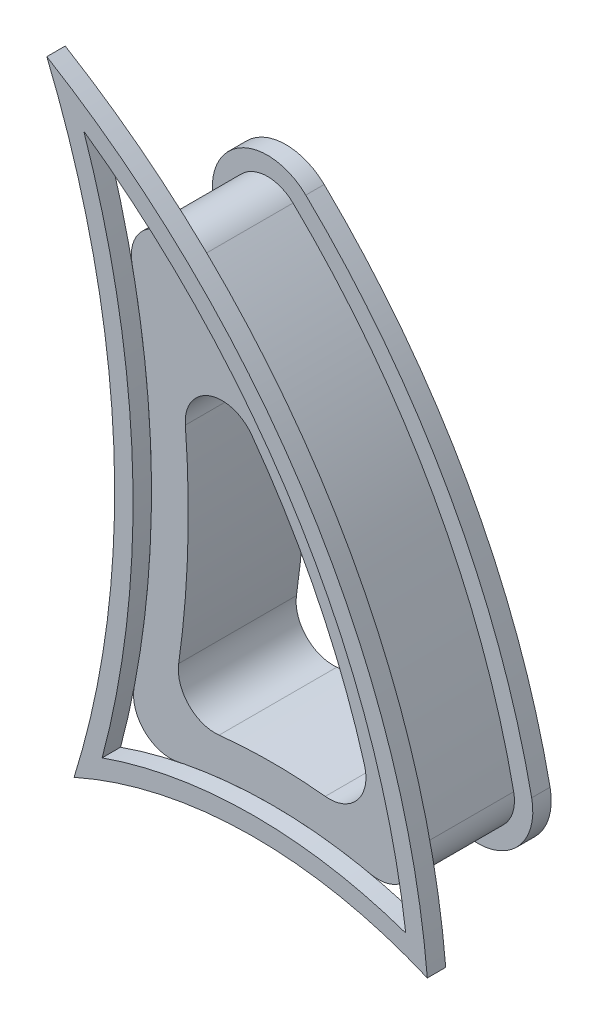
ISO-10303-21;
HEADER;
FILE_DESCRIPTION(('STEP AP214'),'2;1');
FILE_NAME('part.step','',(''),(''),'','','');
FILE_SCHEMA(('AUTOMOTIVE_DESIGN { 1 0 10303 214 1 1 1 1 }'));
ENDSEC;
DATA;
#1=APPLICATION_CONTEXT('core data for automotive mechanical design processes');
#2=APPLICATION_PROTOCOL_DEFINITION('international standard','automotive_design',2000,#1);
#3=PRODUCT_CONTEXT('',#1,'mechanical');
#4=PRODUCT('Part','Part','',(#3));
#5=PRODUCT_RELATED_PRODUCT_CATEGORY('part','',(#4));
#6=PRODUCT_DEFINITION_FORMATION('','',#4);
#7=PRODUCT_DEFINITION_CONTEXT('part definition',#1,'design');
#8=PRODUCT_DEFINITION('design','',#6,#7);
#9=PRODUCT_DEFINITION_SHAPE('','',#8);
#10=(LENGTH_UNIT() NAMED_UNIT(*) SI_UNIT(.MILLI.,.METRE.));
#11=(NAMED_UNIT(*) PLANE_ANGLE_UNIT() SI_UNIT($,.RADIAN.));
#12=(NAMED_UNIT(*) SI_UNIT($,.STERADIAN.) SOLID_ANGLE_UNIT());
#13=UNCERTAINTY_MEASURE_WITH_UNIT(LENGTH_MEASURE(1.E-05),#10,'distance_accuracy_value','');
#14=(GEOMETRIC_REPRESENTATION_CONTEXT(3) GLOBAL_UNCERTAINTY_ASSIGNED_CONTEXT((#13)) GLOBAL_UNIT_ASSIGNED_CONTEXT((#10,
#11,#12)) REPRESENTATION_CONTEXT('',''));
#15=CARTESIAN_POINT('',(0.,0.,0.));
#16=DIRECTION('',(0.,0.,1.));
#17=DIRECTION('',(1.,0.,0.));
#18=AXIS2_PLACEMENT_3D('',#15,#16,#17);
#19=CARTESIAN_POINT('',(0.,-23.5995233002703,7.4));
#20=DIRECTION('',(0.,0.,-1.));
#21=DIRECTION('',(-1.,0.,0.));
#22=AXIS2_PLACEMENT_3D('',#19,#20,#21);
#23=CYLINDRICAL_SURFACE('',#22,24.);
#24=CARTESIAN_POINT('',(0.,-23.5995233002703,6.4));
#25=DIRECTION('',(0.,0.,1.));
#26=DIRECTION('',(1.,0.,0.));
#27=AXIS2_PLACEMENT_3D('',#24,#25,#26);
#28=CIRCLE('',#27,24.);
#29=CARTESIAN_POINT('',(9.42209619594548,-1.5263698492033,6.4));
#30=VERTEX_POINT('',#29);
#31=CARTESIAN_POINT('',(-9.77451940456791,-1.68015354633519,6.4));
#32=VERTEX_POINT('',#31);
#33=EDGE_CURVE('E183',#30,#32,#28,.T.);
#34=ORIENTED_EDGE('',*,*,#33,.F.);
#35=DIRECTION('',(0.,0.,-1.));
#36=VECTOR('',#35,1.);
#37=CARTESIAN_POINT('',(9.42209619594548,-1.5263698492033,7.4));
#38=LINE('',#37,#36);
#39=CARTESIAN_POINT('',(9.42209619594548,-1.5263698492033,7.4));
#40=VERTEX_POINT('',#39);
#41=EDGE_CURVE('E13',#40,#30,#38,.T.);
#42=ORIENTED_EDGE('',*,*,#41,.F.);
#43=CARTESIAN_POINT('',(0.,-23.5995233002703,7.4));
#44=DIRECTION('',(0.,0.,1.));
#45=DIRECTION('',(1.,0.,0.));
#46=AXIS2_PLACEMENT_3D('',#43,#44,#45);
#47=CIRCLE('',#46,24.);
#48=CARTESIAN_POINT('',(-9.77451940456791,-1.68015354633519,7.4));
#49=VERTEX_POINT('',#48);
#50=EDGE_CURVE('E189',#40,#49,#47,.T.);
#51=ORIENTED_EDGE('',*,*,#50,.T.);
#52=DIRECTION('',(0.,0.,-1.));
#53=VECTOR('',#52,1.);
#54=CARTESIAN_POINT('',(-9.77451940456791,-1.68015354633519,7.4));
#55=LINE('',#54,#53);
#56=EDGE_CURVE('E109',#49,#32,#55,.T.);
#57=ORIENTED_EDGE('',*,*,#56,.T.);
#58=EDGE_LOOP('',(#34,#42,#51,#57));
#59=FACE_BOUND('',#58,.T.);
#60=ADVANCED_FACE('F110',(#59),#23,.F.);
#61=CARTESIAN_POINT('',(-33.4068852451154,-5.35760316515584,7.4));
#62=DIRECTION('',(0.,0.,-1.));
#63=DIRECTION('',(-1.,0.,0.));
#64=AXIS2_PLACEMENT_3D('',#61,#62,#63);
#65=CYLINDRICAL_SURFACE('',#64,43.);
#66=CARTESIAN_POINT('',(-33.4068852451154,-5.35760316515584,6.4));
#67=DIRECTION('',(0.,0.,1.));
#68=DIRECTION('',(1.,0.,0.));
#69=AXIS2_PLACEMENT_3D('',#66,#67,#68);
#70=CIRCLE('',#69,43.);
#71=CARTESIAN_POINT('',(-11.2574176727045,31.498889970501,6.4));
#72=VERTEX_POINT('',#71);
#73=EDGE_CURVE('E192',#30,#72,#70,.T.);
#74=ORIENTED_EDGE('',*,*,#73,.T.);
#75=DIRECTION('',(0.,0.,-1.));
#76=VECTOR('',#75,1.);
#77=CARTESIAN_POINT('',(-11.2574176727045,31.498889970501,7.4));
#78=LINE('',#77,#76);
#79=CARTESIAN_POINT('',(-11.2574176727045,31.498889970501,7.4));
#80=VERTEX_POINT('',#79);
#81=EDGE_CURVE('E113',#80,#72,#78,.T.);
#82=ORIENTED_EDGE('',*,*,#81,.F.);
#83=CARTESIAN_POINT('',(-33.4068852451154,-5.35760316515584,7.4));
#84=DIRECTION('',(0.,0.,1.));
#85=DIRECTION('',(1.,0.,0.));
#86=AXIS2_PLACEMENT_3D('',#83,#84,#85);
#87=CIRCLE('',#86,43.);
#88=EDGE_CURVE('E191',#40,#80,#87,.T.);
#89=ORIENTED_EDGE('',*,*,#88,.F.);
#90=ORIENTED_EDGE('',*,*,#41,.T.);
#91=EDGE_LOOP('',(#74,#82,#89,#90));
#92=FACE_BOUND('',#91,.T.);
#93=ADVANCED_FACE('F212',(#92),#65,.T.);
#94=CARTESIAN_POINT('',(-56.570297770506,12.8510242148101,7.4));
#95=DIRECTION('',(0.,0.,-1.));
#96=DIRECTION('',(-1.,0.,0.));
#97=AXIS2_PLACEMENT_3D('',#94,#95,#96);
#98=CYLINDRICAL_SURFACE('',#97,49.);
#99=CARTESIAN_POINT('',(-56.570297770506,12.8510242148101,6.4));
#100=DIRECTION('',(0.,0.,1.));
#101=DIRECTION('',(1.,0.,0.));
#102=AXIS2_PLACEMENT_3D('',#99,#100,#101);
#103=CIRCLE('',#102,49.);
#104=EDGE_CURVE('E196',#32,#72,#103,.T.);
#105=ORIENTED_EDGE('',*,*,#104,.F.);
#106=ORIENTED_EDGE('',*,*,#56,.F.);
#107=CARTESIAN_POINT('',(-56.570297770506,12.8510242148101,7.4));
#108=DIRECTION('',(0.,0.,1.));
#109=DIRECTION('',(1.,0.,0.));
#110=AXIS2_PLACEMENT_3D('',#107,#108,#109);
#111=CIRCLE('',#110,49.);
#112=EDGE_CURVE('E188',#49,#80,#111,.T.);
#113=ORIENTED_EDGE('',*,*,#112,.T.);
#114=ORIENTED_EDGE('',*,*,#81,.T.);
#115=EDGE_LOOP('',(#105,#106,#113,#114));
#116=FACE_BOUND('',#115,.T.);
#117=ADVANCED_FACE('F207',(#116),#98,.F.);
#118=CARTESIAN_POINT('',(-28.285148885253,-5.37424954273008,7.4));
#119=DIRECTION('',(0.,0.,1.));
#120=DIRECTION('',(1.,0.,0.));
#121=AXIS2_PLACEMENT_3D('',#118,#119,#120);
#122=PLANE('',#121);
#123=CARTESIAN_POINT('',(0.,-23.5995233002703,7.4));
#124=DIRECTION('',(0.,0.,1.));
#125=DIRECTION('',(1.,0.,0.));
#126=AXIS2_PLACEMENT_3D('',#123,#124,#125);
#127=CIRCLE('',#126,25.);
#128=CARTESIAN_POINT('',(8.25000000000001,0.,7.4));
#129=VERTEX_POINT('',#128);
#130=CARTESIAN_POINT('',(-8.25,0.,7.4));
#131=VERTEX_POINT('',#130);
#132=EDGE_CURVE('E165',#129,#131,#127,.T.);
#133=ORIENTED_EDGE('',*,*,#132,.T.);
#134=CARTESIAN_POINT('',(-56.570297770506,12.8510242148101,7.4));
#135=DIRECTION('',(0.,0.,1.));
#136=DIRECTION('',(1.,0.,0.));
#137=AXIS2_PLACEMENT_3D('',#134,#135,#136);
#138=CIRCLE('',#137,50.);
#139=CARTESIAN_POINT('',(-9.25000000000001,29.,7.4));
#140=VERTEX_POINT('',#139);
#141=EDGE_CURVE('E169',#131,#140,#138,.T.);
#142=ORIENTED_EDGE('',*,*,#141,.T.);
#143=CARTESIAN_POINT('',(-33.4068852451154,-5.35760316515584,7.4));
#144=DIRECTION('',(0.,0.,1.));
#145=DIRECTION('',(1.,0.,0.));
#146=AXIS2_PLACEMENT_3D('',#143,#144,#145);
#147=CIRCLE('',#146,42.);
#148=EDGE_CURVE('E164',#129,#140,#147,.T.);
#149=ORIENTED_EDGE('',*,*,#148,.F.);
#150=EDGE_LOOP('',(#133,#142,#149));
#151=FACE_BOUND('',#150,.T.);
#152=ORIENTED_EDGE('',*,*,#50,.F.);
#153=ORIENTED_EDGE('',*,*,#88,.T.);
#154=ORIENTED_EDGE('',*,*,#112,.F.);
#155=EDGE_LOOP('',(#152,#153,#154));
#156=FACE_BOUND('',#155,.T.);
#157=ADVANCED_FACE('F174',(#151,#156),#122,.T.);
#158=CARTESIAN_POINT('',(-28.285148885253,-5.37424954273008,6.4));
#159=DIRECTION('',(0.,0.,1.));
#160=DIRECTION('',(1.,0.,0.));
#161=AXIS2_PLACEMENT_3D('',#158,#159,#160);
#162=PLANE('',#161);
#163=CARTESIAN_POINT('',(-56.570297770506,12.8510242148101,6.4));
#164=DIRECTION('',(0.,0.,1.));
#165=DIRECTION('',(1.,0.,0.));
#166=AXIS2_PLACEMENT_3D('',#163,#164,#165);
#167=CIRCLE('',#166,50.);
#168=CARTESIAN_POINT('',(-8.25,0.,6.4));
#169=VERTEX_POINT('',#168);
#170=CARTESIAN_POINT('',(-9.25000000000002,29.,6.4));
#171=VERTEX_POINT('',#170);
#172=EDGE_CURVE('E180',#169,#171,#167,.T.);
#173=ORIENTED_EDGE('',*,*,#172,.F.);
#174=CARTESIAN_POINT('',(0.,-23.5995233002703,6.4));
#175=DIRECTION('',(0.,0.,1.));
#176=DIRECTION('',(1.,0.,0.));
#177=AXIS2_PLACEMENT_3D('',#174,#175,#176);
#178=CIRCLE('',#177,25.);
#179=CARTESIAN_POINT('',(8.25000000000001,0.,6.4));
#180=VERTEX_POINT('',#179);
#181=EDGE_CURVE('E132',#180,#169,#178,.T.);
#182=ORIENTED_EDGE('',*,*,#181,.F.);
#183=CARTESIAN_POINT('',(-33.4068852451154,-5.35760316515584,6.4));
#184=DIRECTION('',(0.,0.,1.));
#185=DIRECTION('',(1.,0.,0.));
#186=AXIS2_PLACEMENT_3D('',#183,#184,#185);
#187=CIRCLE('',#186,42.);
#188=EDGE_CURVE('E171',#180,#171,#187,.T.);
#189=ORIENTED_EDGE('',*,*,#188,.T.);
#190=EDGE_LOOP('',(#173,#182,#189));
#191=FACE_BOUND('',#190,.T.);
#192=ORIENTED_EDGE('',*,*,#33,.T.);
#193=ORIENTED_EDGE('',*,*,#104,.T.);
#194=ORIENTED_EDGE('',*,*,#73,.F.);
#195=EDGE_LOOP('',(#192,#193,#194));
#196=FACE_BOUND('',#195,.T.);
#197=ADVANCED_FACE('F215',(#191,#196),#162,.F.);
#198=CARTESIAN_POINT('',(0.,-23.5995233002703,7.4));
#199=DIRECTION('',(0.,0.,-1.));
#200=DIRECTION('',(-1.,0.,0.));
#201=AXIS2_PLACEMENT_3D('',#198,#199,#200);
#202=CYLINDRICAL_SURFACE('',#201,25.);
#203=ORIENTED_EDGE('',*,*,#181,.T.);
#204=DIRECTION('',(0.,0.,-1.));
#205=VECTOR('',#204,1.);
#206=CARTESIAN_POINT('',(-8.25,0.,7.4));
#207=LINE('',#206,#205);
#208=EDGE_CURVE('E157',#131,#169,#207,.T.);
#209=ORIENTED_EDGE('',*,*,#208,.F.);
#210=ORIENTED_EDGE('',*,*,#132,.F.);
#211=DIRECTION('',(0.,0.,-1.));
#212=VECTOR('',#211,1.);
#213=CARTESIAN_POINT('',(8.25000000000001,0.,7.4));
#214=LINE('',#213,#212);
#215=EDGE_CURVE('E181',#129,#180,#214,.T.);
#216=ORIENTED_EDGE('',*,*,#215,.T.);
#217=EDGE_LOOP('',(#203,#209,#210,#216));
#218=FACE_BOUND('',#217,.T.);
#219=ADVANCED_FACE('F159',(#218),#202,.T.);
#220=CARTESIAN_POINT('',(-33.4068852451154,-5.35760316515584,7.4));
#221=DIRECTION('',(0.,0.,-1.));
#222=DIRECTION('',(-1.,0.,0.));
#223=AXIS2_PLACEMENT_3D('',#220,#221,#222);
#224=CYLINDRICAL_SURFACE('',#223,42.);
#225=ORIENTED_EDGE('',*,*,#188,.F.);
#226=ORIENTED_EDGE('',*,*,#215,.F.);
#227=ORIENTED_EDGE('',*,*,#148,.T.);
#228=DIRECTION('',(0.,0.,-1.));
#229=VECTOR('',#228,1.);
#230=CARTESIAN_POINT('',(-9.25000000000002,29.,7.4));
#231=LINE('',#230,#229);
#232=EDGE_CURVE('E124',#140,#171,#231,.T.);
#233=ORIENTED_EDGE('',*,*,#232,.T.);
#234=EDGE_LOOP('',(#225,#226,#227,#233));
#235=FACE_BOUND('',#234,.T.);
#236=ADVANCED_FACE('F260',(#235),#224,.F.);
#237=CARTESIAN_POINT('',(-56.570297770506,12.8510242148101,7.4));
#238=DIRECTION('',(0.,0.,-1.));
#239=DIRECTION('',(-1.,0.,0.));
#240=AXIS2_PLACEMENT_3D('',#237,#238,#239);
#241=CYLINDRICAL_SURFACE('',#240,50.);
#242=ORIENTED_EDGE('',*,*,#172,.T.);
#243=ORIENTED_EDGE('',*,*,#232,.F.);
#244=ORIENTED_EDGE('',*,*,#141,.F.);
#245=ORIENTED_EDGE('',*,*,#208,.T.);
#246=EDGE_LOOP('',(#242,#243,#244,#245));
#247=FACE_BOUND('',#246,.T.);
#248=ADVANCED_FACE('F166',(#247),#241,.T.);
#249=CLOSED_SHELL('',(#60,#93,#117,#157,#197,#219,#236,#248));
#250=MANIFOLD_SOLID_BREP('B2_NOT_SHOWN',#249);
#251=CARTESIAN_POINT('',(-56.570297770506,12.8510242148101,6.4));
#252=DIRECTION('',(0.,0.,-1.));
#253=DIRECTION('',(-1.,0.,0.));
#254=AXIS2_PLACEMENT_3D('',#251,#252,#253);
#255=CYLINDRICAL_SURFACE('',#254,50.);
#256=CARTESIAN_POINT('',(-56.570297770506,12.8510242148101,1.));
#257=DIRECTION('',(0.,0.,1.));
#258=DIRECTION('',(1.,0.,0.));
#259=AXIS2_PLACEMENT_3D('',#256,#257,#258);
#260=CIRCLE('',#259,50.);
#261=CARTESIAN_POINT('',(-7.50852473276543,3.21035896840542,1.));
#262=VERTEX_POINT('',#261);
#263=CARTESIAN_POINT('',(-7.62142219676139,23.0494348785397,1.));
#264=VERTEX_POINT('',#263);
#265=EDGE_CURVE('E437',#262,#264,#260,.T.);
#266=ORIENTED_EDGE('',*,*,#265,.F.);
#267=DIRECTION('',(0.,0.,-1.));
#268=VECTOR('',#267,1.);
#269=CARTESIAN_POINT('',(-7.50852473276543,3.21035896840542,6.4));
#270=LINE('',#269,#268);
#271=CARTESIAN_POINT('',(-7.50852473276543,3.21035896840542,6.4));
#272=VERTEX_POINT('',#271);
#273=EDGE_CURVE('E423',#262,#272,#270,.F.);
#274=ORIENTED_EDGE('',*,*,#273,.T.);
#275=CARTESIAN_POINT('',(-56.570297770506,12.8510242148101,6.4));
#276=DIRECTION('',(0.,0.,1.));
#277=DIRECTION('',(1.,0.,0.));
#278=AXIS2_PLACEMENT_3D('',#275,#276,#277);
#279=CIRCLE('',#278,50.);
#280=CARTESIAN_POINT('',(-7.62142219676139,23.0494348785397,6.4));
#281=VERTEX_POINT('',#280);
#282=EDGE_CURVE('E468',#272,#281,#279,.T.);
#283=ORIENTED_EDGE('',*,*,#282,.T.);
#284=DIRECTION('',(0.,0.,-1.));
#285=VECTOR('',#284,1.);
#286=CARTESIAN_POINT('',(-7.62142219676139,23.0494348785397,6.4));
#287=LINE('',#286,#285);
#288=EDGE_CURVE('E493',#281,#264,#287,.T.);
#289=ORIENTED_EDGE('',*,*,#288,.T.);
#290=EDGE_LOOP('',(#266,#274,#283,#289));
#291=FACE_BOUND('',#290,.T.);
#292=ADVANCED_FACE('F283',(#291),#255,.F.);
#293=CARTESIAN_POINT('',(0.,-23.5995233002703,6.4));
#294=DIRECTION('',(0.,0.,-1.));
#295=DIRECTION('',(-1.,0.,0.));
#296=AXIS2_PLACEMENT_3D('',#293,#294,#295);
#297=CYLINDRICAL_SURFACE('',#296,25.);
#298=CARTESIAN_POINT('',(0.,-23.5995233002703,1.));
#299=DIRECTION('',(0.,0.,1.));
#300=DIRECTION('',(1.,0.,0.));
#301=AXIS2_PLACEMENT_3D('',#298,#299,#300);
#302=CIRCLE('',#301,25.);
#303=CARTESIAN_POINT('',(-5.13523501042203,0.867380087525564,1.));
#304=VERTEX_POINT('',#303);
#305=CARTESIAN_POINT('',(5.33026314824745,0.825633705784673,1.));
#306=VERTEX_POINT('',#305);
#307=EDGE_CURVE('E444',#304,#306,#302,.F.);
#308=ORIENTED_EDGE('',*,*,#307,.T.);
#309=DIRECTION('',(0.,0.,-1.));
#310=VECTOR('',#309,1.);
#311=CARTESIAN_POINT('',(5.33026314824745,0.825633705784673,6.4));
#312=LINE('',#311,#310);
#313=CARTESIAN_POINT('',(5.33026314824745,0.825633705784673,6.4));
#314=VERTEX_POINT('',#313);
#315=EDGE_CURVE('E413',#306,#314,#312,.F.);
#316=ORIENTED_EDGE('',*,*,#315,.T.);
#317=CARTESIAN_POINT('',(0.,-23.5995233002703,6.4));
#318=DIRECTION('',(0.,0.,1.));
#319=DIRECTION('',(1.,0.,0.));
#320=AXIS2_PLACEMENT_3D('',#317,#318,#319);
#321=CIRCLE('',#320,25.);
#322=CARTESIAN_POINT('',(-5.13523501042203,0.867380087525564,6.4));
#323=VERTEX_POINT('',#322);
#324=EDGE_CURVE('E471',#323,#314,#321,.F.);
#325=ORIENTED_EDGE('',*,*,#324,.F.);
#326=DIRECTION('',(0.,0.,-1.));
#327=VECTOR('',#326,1.);
#328=CARTESIAN_POINT('',(-5.13523501042203,0.867380087525564,6.4));
#329=LINE('',#328,#327);
#330=EDGE_CURVE('E431',#323,#304,#329,.T.);
#331=ORIENTED_EDGE('',*,*,#330,.T.);
#332=EDGE_LOOP('',(#308,#316,#325,#331));
#333=FACE_BOUND('',#332,.T.);
#334=ADVANCED_FACE('F577',(#333),#297,.F.);
#335=CARTESIAN_POINT('',(0.,-23.5995233002703,6.4));
#336=DIRECTION('',(0.,0.,-1.));
#337=DIRECTION('',(-1.,0.,0.));
#338=AXIS2_PLACEMENT_3D('',#335,#336,#337);
#339=CYLINDRICAL_SURFACE('',#338,27.);
#340=CARTESIAN_POINT('',(0.,-23.5995233002703,0.));
#341=DIRECTION('',(0.,0.,1.));
#342=DIRECTION('',(1.,0.,0.));
#343=AXIS2_PLACEMENT_3D('',#340,#341,#342);
#344=CIRCLE('',#343,27.);
#345=CARTESIAN_POINT('',(-2.89581937473861,3.24473549279176,0.));
#346=VERTEX_POINT('',#345);
#347=CARTESIAN_POINT('',(2.87381575181932,3.24710000741211,0.));
#348=VERTEX_POINT('',#347);
#349=EDGE_CURVE('E452',#346,#348,#344,.F.);
#350=ORIENTED_EDGE('',*,*,#349,.F.);
#351=DIRECTION('',(0.,0.,-1.));
#352=VECTOR('',#351,1.);
#353=CARTESIAN_POINT('',(-2.89581937473861,3.24473549279176,6.4));
#354=LINE('',#353,#352);
#355=CARTESIAN_POINT('',(-2.89581937473861,3.24473549279176,6.4));
#356=VERTEX_POINT('',#355);
#357=EDGE_CURVE('E509',#346,#356,#354,.F.);
#358=ORIENTED_EDGE('',*,*,#357,.T.);
#359=CARTESIAN_POINT('',(0.,-23.5995233002703,6.4));
#360=DIRECTION('',(0.,0.,1.));
#361=DIRECTION('',(1.,0.,0.));
#362=AXIS2_PLACEMENT_3D('',#359,#360,#361);
#363=CIRCLE('',#362,27.);
#364=CARTESIAN_POINT('',(2.87381575181932,3.24710000741211,6.4));
#365=VERTEX_POINT('',#364);
#366=EDGE_CURVE('E458',#356,#365,#363,.F.);
#367=ORIENTED_EDGE('',*,*,#366,.T.);
#368=DIRECTION('',(0.,0.,-1.));
#369=VECTOR('',#368,1.);
#370=CARTESIAN_POINT('',(2.87381575181932,3.24710000741212,6.4));
#371=LINE('',#370,#369);
#372=EDGE_CURVE('E503',#365,#348,#371,.T.);
#373=ORIENTED_EDGE('',*,*,#372,.T.);
#374=EDGE_LOOP('',(#350,#358,#367,#373));
#375=FACE_BOUND('',#374,.T.);
#376=ADVANCED_FACE('F582',(#375),#339,.T.);
#377=CARTESIAN_POINT('',(-56.570297770506,12.8510242148101,6.4));
#378=DIRECTION('',(0.,0.,-1.));
#379=DIRECTION('',(-1.,0.,0.));
#380=AXIS2_PLACEMENT_3D('',#377,#378,#379);
#381=CYLINDRICAL_SURFACE('',#380,52.);
#382=CARTESIAN_POINT('',(-56.570297770506,12.8510242148101,6.4));
#383=DIRECTION('',(0.,0.,1.));
#384=DIRECTION('',(1.,0.,0.));
#385=AXIS2_PLACEMENT_3D('',#382,#383,#384);
#386=CIRCLE('',#385,52.);
#387=CARTESIAN_POINT('',(-5.09032352312287,5.51534077774886,6.4));
#388=VERTEX_POINT('',#387);
#389=CARTESIAN_POINT('',(-4.72973998617911,16.9200005737817,6.4));
#390=VERTEX_POINT('',#389);
#391=EDGE_CURVE('E465',#388,#390,#386,.T.);
#392=ORIENTED_EDGE('',*,*,#391,.F.);
#393=DIRECTION('',(0.,0.,-1.));
#394=VECTOR('',#393,1.);
#395=CARTESIAN_POINT('',(-5.09032352312287,5.51534077774886,6.4));
#396=LINE('',#395,#394);
#397=CARTESIAN_POINT('',(-5.09032352312287,5.51534077774886,0.));
#398=VERTEX_POINT('',#397);
#399=EDGE_CURVE('E504',#388,#398,#396,.T.);
#400=ORIENTED_EDGE('',*,*,#399,.T.);
#401=CARTESIAN_POINT('',(-56.570297770506,12.8510242148101,0.));
#402=DIRECTION('',(0.,0.,1.));
#403=DIRECTION('',(1.,0.,0.));
#404=AXIS2_PLACEMENT_3D('',#401,#402,#403);
#405=CIRCLE('',#404,52.);
#406=CARTESIAN_POINT('',(-4.72973998617911,16.9200005737817,0.));
#407=VERTEX_POINT('',#406);
#408=EDGE_CURVE('E479',#398,#407,#405,.T.);
#409=ORIENTED_EDGE('',*,*,#408,.T.);
#410=DIRECTION('',(0.,0.,-1.));
#411=VECTOR('',#410,1.);
#412=CARTESIAN_POINT('',(-4.72973998617911,16.9200005737817,6.4));
#413=LINE('',#412,#411);
#414=EDGE_CURVE('E498',#407,#390,#413,.F.);
#415=ORIENTED_EDGE('',*,*,#414,.T.);
#416=EDGE_LOOP('',(#392,#400,#409,#415));
#417=FACE_BOUND('',#416,.T.);
#418=ADVANCED_FACE('F591',(#417),#381,.T.);
#419=CARTESIAN_POINT('',(-33.4068852451154,-5.35760316515584,6.4));
#420=DIRECTION('',(0.,0.,-1.));
#421=DIRECTION('',(-1.,0.,0.));
#422=AXIS2_PLACEMENT_3D('',#419,#420,#421);
#423=CYLINDRICAL_SURFACE('',#422,40.);
#424=CARTESIAN_POINT('',(-33.4068852451154,-5.35760316515584,0.));
#425=DIRECTION('',(0.,0.,1.));
#426=DIRECTION('',(1.,0.,0.));
#427=AXIS2_PLACEMENT_3D('',#424,#425,#426);
#428=CIRCLE('',#427,40.);
#429=CARTESIAN_POINT('',(5.00740553152693,5.79328308337046,0.));
#430=VERTEX_POINT('',#429);
#431=CARTESIAN_POINT('',(-1.12160854403562,18.2572419187044,0.));
#432=VERTEX_POINT('',#431);
#433=EDGE_CURVE('E461',#430,#432,#428,.T.);
#434=ORIENTED_EDGE('',*,*,#433,.F.);
#435=DIRECTION('',(0.,0.,-1.));
#436=VECTOR('',#435,1.);
#437=CARTESIAN_POINT('',(5.00740553152693,5.79328308337046,6.4));
#438=LINE('',#437,#436);
#439=CARTESIAN_POINT('',(5.00740553152693,5.79328308337046,6.4));
#440=VERTEX_POINT('',#439);
#441=EDGE_CURVE('E511',#430,#440,#438,.F.);
#442=ORIENTED_EDGE('',*,*,#441,.T.);
#443=CARTESIAN_POINT('',(-33.4068852451154,-5.35760316515584,6.4));
#444=DIRECTION('',(0.,0.,1.));
#445=DIRECTION('',(1.,0.,0.));
#446=AXIS2_PLACEMENT_3D('',#443,#444,#445);
#447=CIRCLE('',#446,40.);
#448=CARTESIAN_POINT('',(-1.12160854403562,18.2572419187044,6.4));
#449=VERTEX_POINT('',#448);
#450=EDGE_CURVE('E470',#440,#449,#447,.T.);
#451=ORIENTED_EDGE('',*,*,#450,.T.);
#452=DIRECTION('',(0.,0.,-1.));
#453=VECTOR('',#452,1.);
#454=CARTESIAN_POINT('',(-1.12160854403562,18.2572419187044,6.4));
#455=LINE('',#454,#453);
#456=EDGE_CURVE('E508',#449,#432,#455,.T.);
#457=ORIENTED_EDGE('',*,*,#456,.T.);
#458=EDGE_LOOP('',(#434,#442,#451,#457));
#459=FACE_BOUND('',#458,.T.);
#460=ADVANCED_FACE('F586',(#459),#423,.F.);
#461=CARTESIAN_POINT('',(-33.4068852451154,-5.35760316515584,6.4));
#462=DIRECTION('',(0.,0.,-1.));
#463=DIRECTION('',(-1.,0.,0.));
#464=AXIS2_PLACEMENT_3D('',#461,#462,#463);
#465=CYLINDRICAL_SURFACE('',#464,42.);
#466=CARTESIAN_POINT('',(-33.4068852451154,-5.35760316515584,6.4));
#467=DIRECTION('',(0.,0.,1.));
#468=DIRECTION('',(1.,0.,0.));
#469=AXIS2_PLACEMENT_3D('',#466,#467,#468);
#470=CIRCLE('',#469,42.);
#471=CARTESIAN_POINT('',(7.71486267236837,3.18650873784031,6.4));
#472=VERTEX_POINT('',#471);
#473=CARTESIAN_POINT('',(-4.27629627024642,24.8981200286011,6.4));
#474=VERTEX_POINT('',#473);
#475=EDGE_CURVE('E429',#472,#474,#470,.T.);
#476=ORIENTED_EDGE('',*,*,#475,.F.);
#477=DIRECTION('',(0.,0.,-1.));
#478=VECTOR('',#477,1.);
#479=CARTESIAN_POINT('',(7.71486267236838,3.18650873784031,6.4));
#480=LINE('',#479,#478);
#481=CARTESIAN_POINT('',(7.71486267236837,3.18650873784031,1.));
#482=VERTEX_POINT('',#481);
#483=EDGE_CURVE('E411',#472,#482,#480,.T.);
#484=ORIENTED_EDGE('',*,*,#483,.T.);
#485=CARTESIAN_POINT('',(-33.4068852451154,-5.35760316515584,1.));
#486=DIRECTION('',(0.,0.,1.));
#487=DIRECTION('',(1.,0.,0.));
#488=AXIS2_PLACEMENT_3D('',#485,#486,#487);
#489=CIRCLE('',#488,42.);
#490=CARTESIAN_POINT('',(-4.27629627024642,24.8981200286011,1.));
#491=VERTEX_POINT('',#490);
#492=EDGE_CURVE('E430',#482,#491,#489,.T.);
#493=ORIENTED_EDGE('',*,*,#492,.T.);
#494=DIRECTION('',(0.,0.,-1.));
#495=VECTOR('',#494,1.);
#496=CARTESIAN_POINT('',(-4.27629627024642,24.8981200286011,6.4));
#497=LINE('',#496,#495);
#498=EDGE_CURVE('E435',#491,#474,#497,.F.);
#499=ORIENTED_EDGE('',*,*,#498,.T.);
#500=EDGE_LOOP('',(#476,#484,#493,#499));
#501=FACE_BOUND('',#500,.T.);
#502=ADVANCED_FACE('F426',(#501),#465,.T.);
#503=CARTESIAN_POINT('',(0.,0.,6.4));
#504=DIRECTION('',(0.,0.,1.));
#505=DIRECTION('',(1.,0.,0.));
#506=AXIS2_PLACEMENT_3D('',#503,#504,#505);
#507=PLANE('',#506);
#508=ORIENTED_EDGE('',*,*,#366,.F.);
#509=CARTESIAN_POINT('',(-3.11032451360814,5.23319910709265,6.4));
#510=DIRECTION('',(0.,0.,1.));
#511=DIRECTION('',(1.,0.,0.));
#512=AXIS2_PLACEMENT_3D('',#509,#510,#511);
#513=CIRCLE('',#512,2.);
#514=EDGE_CURVE('E519',#356,#388,#513,.F.);
#515=ORIENTED_EDGE('',*,*,#514,.T.);
#516=ORIENTED_EDGE('',*,*,#391,.T.);
#517=CARTESIAN_POINT('',(-2.73587237908961,17.0764996645113,6.4));
#518=DIRECTION('',(0.,0.,1.));
#519=DIRECTION('',(1.,0.,0.));
#520=AXIS2_PLACEMENT_3D('',#517,#518,#519);
#521=CIRCLE('',#520,2.);
#522=EDGE_CURVE('E523',#390,#449,#521,.F.);
#523=ORIENTED_EDGE('',*,*,#522,.T.);
#524=ORIENTED_EDGE('',*,*,#450,.F.);
#525=CARTESIAN_POINT('',(3.08669099269482,5.23573877094415,6.4));
#526=DIRECTION('',(0.,0.,1.));
#527=DIRECTION('',(1.,0.,0.));
#528=AXIS2_PLACEMENT_3D('',#525,#526,#527);
#529=CIRCLE('',#528,2.);
#530=EDGE_CURVE('E522',#440,#365,#529,.F.);
#531=ORIENTED_EDGE('',*,*,#530,.T.);
#532=EDGE_LOOP('',(#508,#515,#516,#523,#524,#531));
#533=FACE_BOUND('',#532,.T.);
#534=ORIENTED_EDGE('',*,*,#324,.T.);
#535=CARTESIAN_POINT('',(5.75668420010724,2.77964626626907,6.4));
#536=DIRECTION('',(0.,0.,1.));
#537=DIRECTION('',(1.,0.,0.));
#538=AXIS2_PLACEMENT_3D('',#535,#536,#537);
#539=CIRCLE('',#538,2.);
#540=EDGE_CURVE('E495',#314,#472,#539,.T.);
#541=ORIENTED_EDGE('',*,*,#540,.T.);
#542=ORIENTED_EDGE('',*,*,#475,.T.);
#543=CARTESIAN_POINT('',(-5.66346717381161,23.4573713050889,6.4));
#544=DIRECTION('',(0.,0.,1.));
#545=DIRECTION('',(1.,0.,0.));
#546=AXIS2_PLACEMENT_3D('',#543,#544,#545);
#547=CIRCLE('',#546,2.);
#548=EDGE_CURVE('E488',#474,#281,#547,.T.);
#549=ORIENTED_EDGE('',*,*,#548,.T.);
#550=ORIENTED_EDGE('',*,*,#282,.F.);
#551=CARTESIAN_POINT('',(-5.5460538112558,2.82473235854923,6.4));
#552=DIRECTION('',(0.,0.,1.));
#553=DIRECTION('',(1.,0.,0.));
#554=AXIS2_PLACEMENT_3D('',#551,#552,#553);
#555=CIRCLE('',#554,2.);
#556=EDGE_CURVE('E489',#272,#323,#555,.T.);
#557=ORIENTED_EDGE('',*,*,#556,.T.);
#558=EDGE_LOOP('',(#534,#541,#542,#549,#550,#557));
#559=FACE_BOUND('',#558,.T.);
#560=ADVANCED_FACE('F703',(#533,#559),#507,.T.);
#561=CARTESIAN_POINT('',(0.,0.,0.));
#562=DIRECTION('',(0.,0.,1.));
#563=DIRECTION('',(1.,0.,0.));
#564=AXIS2_PLACEMENT_3D('',#561,#562,#563);
#565=PLANE('',#564);
#566=ORIENTED_EDGE('',*,*,#408,.F.);
#567=CARTESIAN_POINT('',(-3.11032451360814,5.23319910709265,0.));
#568=DIRECTION('',(0.,0.,1.));
#569=DIRECTION('',(1.,0.,0.));
#570=AXIS2_PLACEMENT_3D('',#567,#568,#569);
#571=CIRCLE('',#570,2.);
#572=EDGE_CURVE('E513',#398,#346,#571,.T.);
#573=ORIENTED_EDGE('',*,*,#572,.T.);
#574=ORIENTED_EDGE('',*,*,#349,.T.);
#575=CARTESIAN_POINT('',(3.08669099269482,5.23573877094415,0.));
#576=DIRECTION('',(0.,0.,1.));
#577=DIRECTION('',(1.,0.,0.));
#578=AXIS2_PLACEMENT_3D('',#575,#576,#577);
#579=CIRCLE('',#578,2.);
#580=EDGE_CURVE('E516',#348,#430,#579,.T.);
#581=ORIENTED_EDGE('',*,*,#580,.T.);
#582=ORIENTED_EDGE('',*,*,#433,.T.);
#583=CARTESIAN_POINT('',(-2.73587237908961,17.0764996645113,0.));
#584=DIRECTION('',(0.,0.,1.));
#585=DIRECTION('',(1.,0.,0.));
#586=AXIS2_PLACEMENT_3D('',#583,#584,#585);
#587=CIRCLE('',#586,2.);
#588=EDGE_CURVE('E524',#432,#407,#587,.T.);
#589=ORIENTED_EDGE('',*,*,#588,.T.);
#590=EDGE_LOOP('',(#566,#573,#574,#581,#582,#589));
#591=FACE_BOUND('',#590,.T.);
#592=CARTESIAN_POINT('',(-56.570297770506,12.8510242148101,0.));
#593=DIRECTION('',(0.,0.,1.));
#594=DIRECTION('',(1.,0.,0.));
#595=AXIS2_PLACEMENT_3D('',#592,#593,#594);
#596=CIRCLE('',#595,49.);
#597=CARTESIAN_POINT('',(-8.48976019352023,3.40317227333352,0.));
#598=VERTEX_POINT('',#597);
#599=CARTESIAN_POINT('',(-8.60039970823629,22.8454666652651,0.));
#600=VERTEX_POINT('',#599);
#601=EDGE_CURVE('E455',#598,#600,#596,.T.);
#602=ORIENTED_EDGE('',*,*,#601,.T.);
#603=CARTESIAN_POINT('',(-5.66346717381161,23.4573713050889,0.));
#604=DIRECTION('',(0.,0.,1.));
#605=DIRECTION('',(1.,0.,0.));
#606=AXIS2_PLACEMENT_3D('',#603,#604,#605);
#607=CIRCLE('',#606,3.);
#608=CARTESIAN_POINT('',(-3.58271081846383,25.6184943903572,0.));
#609=VERTEX_POINT('',#608);
#610=EDGE_CURVE('E536',#600,#609,#607,.F.);
#611=ORIENTED_EDGE('',*,*,#610,.T.);
#612=CARTESIAN_POINT('',(-33.4068852451154,-5.35760316515584,0.));
#613=DIRECTION('',(0.,0.,1.));
#614=DIRECTION('',(1.,0.,0.));
#615=AXIS2_PLACEMENT_3D('',#612,#613,#614);
#616=CIRCLE('',#615,43.);
#617=CARTESIAN_POINT('',(8.69395190849894,3.38993997362593,0.));
#618=VERTEX_POINT('',#617);
#619=EDGE_CURVE('E460',#618,#609,#616,.T.);
#620=ORIENTED_EDGE('',*,*,#619,.F.);
#621=CARTESIAN_POINT('',(5.75668420010724,2.77964626626907,0.));
#622=DIRECTION('',(0.,0.,1.));
#623=DIRECTION('',(1.,0.,0.));
#624=AXIS2_PLACEMENT_3D('',#621,#622,#623);
#625=CIRCLE('',#624,3.);
#626=CARTESIAN_POINT('',(5.11705262231755,-0.151372574457524,0.));
#627=VERTEX_POINT('',#626);
#628=EDGE_CURVE('E534',#618,#627,#625,.F.);
#629=ORIENTED_EDGE('',*,*,#628,.T.);
#630=CARTESIAN_POINT('',(0.,-23.5995233002703,0.));
#631=DIRECTION('',(0.,0.,1.));
#632=DIRECTION('',(1.,0.,0.));
#633=AXIS2_PLACEMENT_3D('',#630,#631,#632);
#634=CIRCLE('',#633,24.);
#635=CARTESIAN_POINT('',(-4.92982561000515,-0.111296047986268,0.));
#636=VERTEX_POINT('',#635);
#637=EDGE_CURVE('E453',#636,#627,#634,.F.);
#638=ORIENTED_EDGE('',*,*,#637,.F.);
#639=CARTESIAN_POINT('',(-5.5460538112558,2.82473235854923,0.));
#640=DIRECTION('',(0.,0.,1.));
#641=DIRECTION('',(1.,0.,0.));
#642=AXIS2_PLACEMENT_3D('',#639,#640,#641);
#643=CIRCLE('',#642,3.);
#644=EDGE_CURVE('E535',#636,#598,#643,.F.);
#645=ORIENTED_EDGE('',*,*,#644,.T.);
#646=EDGE_LOOP('',(#602,#611,#620,#629,#638,#645));
#647=FACE_BOUND('',#646,.T.);
#648=ADVANCED_FACE('F554',(#591,#647),#565,.F.);
#649=CARTESIAN_POINT('',(-56.570297770506,12.8510242148101,1.));
#650=DIRECTION('',(0.,0.,-1.));
#651=DIRECTION('',(-1.,0.,0.));
#652=AXIS2_PLACEMENT_3D('',#649,#650,#651);
#653=CYLINDRICAL_SURFACE('',#652,49.);
#654=CARTESIAN_POINT('',(-56.570297770506,12.8510242148101,1.));
#655=DIRECTION('',(0.,0.,1.));
#656=DIRECTION('',(1.,0.,0.));
#657=AXIS2_PLACEMENT_3D('',#654,#655,#656);
#658=CIRCLE('',#657,49.);
#659=CARTESIAN_POINT('',(-8.48976019352023,3.40317227333352,1.));
#660=VERTEX_POINT('',#659);
#661=CARTESIAN_POINT('',(-8.60039970823629,22.8454666652651,1.));
#662=VERTEX_POINT('',#661);
#663=EDGE_CURVE('E440',#660,#662,#658,.T.);
#664=ORIENTED_EDGE('',*,*,#663,.T.);
#665=DIRECTION('',(0.,0.,-1.));
#666=VECTOR('',#665,1.);
#667=CARTESIAN_POINT('',(-8.60039970823628,22.8454666652651,1.));
#668=LINE('',#667,#666);
#669=EDGE_CURVE('E530',#662,#600,#668,.T.);
#670=ORIENTED_EDGE('',*,*,#669,.T.);
#671=ORIENTED_EDGE('',*,*,#601,.F.);
#672=DIRECTION('',(0.,0.,-1.));
#673=VECTOR('',#672,1.);
#674=CARTESIAN_POINT('',(-8.48976019352023,3.40317227333352,1.));
#675=LINE('',#674,#673);
#676=EDGE_CURVE('E527',#598,#660,#675,.F.);
#677=ORIENTED_EDGE('',*,*,#676,.T.);
#678=EDGE_LOOP('',(#664,#670,#671,#677));
#679=FACE_BOUND('',#678,.T.);
#680=ADVANCED_FACE('F569',(#679),#653,.F.);
#681=CARTESIAN_POINT('',(0.,-23.5995233002703,1.));
#682=DIRECTION('',(0.,0.,-1.));
#683=DIRECTION('',(-1.,0.,0.));
#684=AXIS2_PLACEMENT_3D('',#681,#682,#683);
#685=CYLINDRICAL_SURFACE('',#684,24.);
#686=ORIENTED_EDGE('',*,*,#637,.T.);
#687=DIRECTION('',(0.,0.,-1.));
#688=VECTOR('',#687,1.);
#689=CARTESIAN_POINT('',(5.11705262231755,-0.151372574457524,1.));
#690=LINE('',#689,#688);
#691=CARTESIAN_POINT('',(5.11705262231755,-0.151372574457524,1.));
#692=VERTEX_POINT('',#691);
#693=EDGE_CURVE('E104',#627,#692,#690,.F.);
#694=ORIENTED_EDGE('',*,*,#693,.T.);
#695=CARTESIAN_POINT('',(0.,-23.5995233002703,1.));
#696=DIRECTION('',(0.,0.,1.));
#697=DIRECTION('',(1.,0.,0.));
#698=AXIS2_PLACEMENT_3D('',#695,#696,#697);
#699=CIRCLE('',#698,24.);
#700=CARTESIAN_POINT('',(-4.92982561000515,-0.111296047986268,1.));
#701=VERTEX_POINT('',#700);
#702=EDGE_CURVE('E442',#701,#692,#699,.F.);
#703=ORIENTED_EDGE('',*,*,#702,.F.);
#704=DIRECTION('',(0.,0.,-1.));
#705=VECTOR('',#704,1.);
#706=CARTESIAN_POINT('',(-4.92982561000515,-0.111296047986265,1.));
#707=LINE('',#706,#705);
#708=EDGE_CURVE('E291',#701,#636,#707,.T.);
#709=ORIENTED_EDGE('',*,*,#708,.T.);
#710=EDGE_LOOP('',(#686,#694,#703,#709));
#711=FACE_BOUND('',#710,.T.);
#712=ADVANCED_FACE('F549',(#711),#685,.F.);
#713=CARTESIAN_POINT('',(-33.4068852451154,-5.35760316515584,1.));
#714=DIRECTION('',(0.,0.,-1.));
#715=DIRECTION('',(-1.,0.,0.));
#716=AXIS2_PLACEMENT_3D('',#713,#714,#715);
#717=CYLINDRICAL_SURFACE('',#716,43.);
#718=ORIENTED_EDGE('',*,*,#619,.T.);
#719=DIRECTION('',(0.,0.,-1.));
#720=VECTOR('',#719,1.);
#721=CARTESIAN_POINT('',(-3.58271081846383,25.6184943903572,1.));
#722=LINE('',#721,#720);
#723=CARTESIAN_POINT('',(-3.58271081846383,25.6184943903572,1.));
#724=VERTEX_POINT('',#723);
#725=EDGE_CURVE('E541',#609,#724,#722,.F.);
#726=ORIENTED_EDGE('',*,*,#725,.T.);
#727=CARTESIAN_POINT('',(-33.4068852451154,-5.35760316515584,1.));
#728=DIRECTION('',(0.,0.,1.));
#729=DIRECTION('',(1.,0.,0.));
#730=AXIS2_PLACEMENT_3D('',#727,#728,#729);
#731=CIRCLE('',#730,43.);
#732=CARTESIAN_POINT('',(8.69395190849894,3.38993997362593,1.));
#733=VERTEX_POINT('',#732);
#734=EDGE_CURVE('E450',#733,#724,#731,.T.);
#735=ORIENTED_EDGE('',*,*,#734,.F.);
#736=DIRECTION('',(0.,0.,-1.));
#737=VECTOR('',#736,1.);
#738=CARTESIAN_POINT('',(8.69395190849894,3.38993997362594,1.));
#739=LINE('',#738,#737);
#740=EDGE_CURVE('E538',#733,#618,#739,.T.);
#741=ORIENTED_EDGE('',*,*,#740,.T.);
#742=EDGE_LOOP('',(#718,#726,#735,#741));
#743=FACE_BOUND('',#742,.T.);
#744=ADVANCED_FACE('F565',(#743),#717,.T.);
#745=CARTESIAN_POINT('',(0.,0.,1.));
#746=DIRECTION('',(0.,0.,1.));
#747=DIRECTION('',(1.,0.,0.));
#748=AXIS2_PLACEMENT_3D('',#745,#746,#747);
#749=PLANE('',#748);
#750=ORIENTED_EDGE('',*,*,#307,.F.);
#751=CARTESIAN_POINT('',(-5.5460538112558,2.82473235854923,1.));
#752=DIRECTION('',(0.,0.,1.));
#753=DIRECTION('',(1.,0.,0.));
#754=AXIS2_PLACEMENT_3D('',#751,#752,#753);
#755=CIRCLE('',#754,2.);
#756=EDGE_CURVE('E419',#304,#262,#755,.F.);
#757=ORIENTED_EDGE('',*,*,#756,.T.);
#758=ORIENTED_EDGE('',*,*,#265,.T.);
#759=CARTESIAN_POINT('',(-5.66346717381161,23.4573713050889,1.));
#760=DIRECTION('',(0.,0.,1.));
#761=DIRECTION('',(1.,0.,0.));
#762=AXIS2_PLACEMENT_3D('',#759,#760,#761);
#763=CIRCLE('',#762,2.);
#764=EDGE_CURVE('E436',#264,#491,#763,.F.);
#765=ORIENTED_EDGE('',*,*,#764,.T.);
#766=ORIENTED_EDGE('',*,*,#492,.F.);
#767=CARTESIAN_POINT('',(5.75668420010724,2.77964626626907,1.));
#768=DIRECTION('',(0.,0.,1.));
#769=DIRECTION('',(1.,0.,0.));
#770=AXIS2_PLACEMENT_3D('',#767,#768,#769);
#771=CIRCLE('',#770,2.);
#772=EDGE_CURVE('E408',#482,#306,#771,.F.);
#773=ORIENTED_EDGE('',*,*,#772,.T.);
#774=EDGE_LOOP('',(#750,#757,#758,#765,#766,#773));
#775=FACE_BOUND('',#774,.T.);
#776=ORIENTED_EDGE('',*,*,#734,.T.);
#777=CARTESIAN_POINT('',(-5.66346717381161,23.4573713050889,1.));
#778=DIRECTION('',(0.,0.,1.));
#779=DIRECTION('',(1.,0.,0.));
#780=AXIS2_PLACEMENT_3D('',#777,#778,#779);
#781=CIRCLE('',#780,3.);
#782=EDGE_CURVE('E546',#724,#662,#781,.T.);
#783=ORIENTED_EDGE('',*,*,#782,.T.);
#784=ORIENTED_EDGE('',*,*,#663,.F.);
#785=CARTESIAN_POINT('',(-5.5460538112558,2.82473235854923,1.));
#786=DIRECTION('',(0.,0.,1.));
#787=DIRECTION('',(1.,0.,0.));
#788=AXIS2_PLACEMENT_3D('',#785,#786,#787);
#789=CIRCLE('',#788,3.);
#790=EDGE_CURVE('E303',#660,#701,#789,.T.);
#791=ORIENTED_EDGE('',*,*,#790,.T.);
#792=ORIENTED_EDGE('',*,*,#702,.T.);
#793=CARTESIAN_POINT('',(5.75668420010724,2.77964626626907,1.));
#794=DIRECTION('',(0.,0.,1.));
#795=DIRECTION('',(1.,0.,0.));
#796=AXIS2_PLACEMENT_3D('',#793,#794,#795);
#797=CIRCLE('',#796,3.);
#798=EDGE_CURVE('E542',#692,#733,#797,.T.);
#799=ORIENTED_EDGE('',*,*,#798,.T.);
#800=EDGE_LOOP('',(#776,#783,#784,#791,#792,#799));
#801=FACE_BOUND('',#800,.T.);
#802=ADVANCED_FACE('F432',(#775,#801),#749,.T.);
#803=CARTESIAN_POINT('',(5.75668420010724,2.77964626626907,6.4));
#804=DIRECTION('',(0.,0.,1.));
#805=DIRECTION('',(1.,0.,0.));
#806=AXIS2_PLACEMENT_3D('',#803,#804,#805);
#807=CYLINDRICAL_SURFACE('',#806,2.);
#808=ORIENTED_EDGE('',*,*,#540,.F.);
#809=ORIENTED_EDGE('',*,*,#315,.F.);
#810=ORIENTED_EDGE('',*,*,#772,.F.);
#811=ORIENTED_EDGE('',*,*,#483,.F.);
#812=EDGE_LOOP('',(#808,#809,#810,#811));
#813=FACE_BOUND('',#812,.T.);
#814=ADVANCED_FACE('F414',(#813),#807,.T.);
#815=CARTESIAN_POINT('',(-5.5460538112558,2.82473235854923,6.4));
#816=DIRECTION('',(0.,0.,-1.));
#817=DIRECTION('',(-1.,0.,0.));
#818=AXIS2_PLACEMENT_3D('',#815,#816,#817);
#819=CYLINDRICAL_SURFACE('',#818,2.);
#820=ORIENTED_EDGE('',*,*,#556,.F.);
#821=ORIENTED_EDGE('',*,*,#273,.F.);
#822=ORIENTED_EDGE('',*,*,#756,.F.);
#823=ORIENTED_EDGE('',*,*,#330,.F.);
#824=EDGE_LOOP('',(#820,#821,#822,#823));
#825=FACE_BOUND('',#824,.T.);
#826=ADVANCED_FACE('F601',(#825),#819,.T.);
#827=CARTESIAN_POINT('',(-5.66346717381161,23.4573713050889,6.4));
#828=DIRECTION('',(0.,0.,1.));
#829=DIRECTION('',(1.,0.,0.));
#830=AXIS2_PLACEMENT_3D('',#827,#828,#829);
#831=CYLINDRICAL_SURFACE('',#830,2.);
#832=ORIENTED_EDGE('',*,*,#548,.F.);
#833=ORIENTED_EDGE('',*,*,#498,.F.);
#834=ORIENTED_EDGE('',*,*,#764,.F.);
#835=ORIENTED_EDGE('',*,*,#288,.F.);
#836=EDGE_LOOP('',(#832,#833,#834,#835));
#837=FACE_BOUND('',#836,.T.);
#838=ADVANCED_FACE('F603',(#837),#831,.T.);
#839=CARTESIAN_POINT('',(-3.11032451360814,5.23319910709265,6.4));
#840=DIRECTION('',(0.,0.,1.));
#841=DIRECTION('',(1.,0.,0.));
#842=AXIS2_PLACEMENT_3D('',#839,#840,#841);
#843=CYLINDRICAL_SURFACE('',#842,2.);
#844=ORIENTED_EDGE('',*,*,#514,.F.);
#845=ORIENTED_EDGE('',*,*,#357,.F.);
#846=ORIENTED_EDGE('',*,*,#572,.F.);
#847=ORIENTED_EDGE('',*,*,#399,.F.);
#848=EDGE_LOOP('',(#844,#845,#846,#847));
#849=FACE_BOUND('',#848,.T.);
#850=ADVANCED_FACE('F609',(#849),#843,.F.);
#851=CARTESIAN_POINT('',(3.08669099269482,5.23573877094415,6.4));
#852=DIRECTION('',(0.,0.,-1.));
#853=DIRECTION('',(-1.,0.,0.));
#854=AXIS2_PLACEMENT_3D('',#851,#852,#853);
#855=CYLINDRICAL_SURFACE('',#854,2.);
#856=ORIENTED_EDGE('',*,*,#530,.F.);
#857=ORIENTED_EDGE('',*,*,#441,.F.);
#858=ORIENTED_EDGE('',*,*,#580,.F.);
#859=ORIENTED_EDGE('',*,*,#372,.F.);
#860=EDGE_LOOP('',(#856,#857,#858,#859));
#861=FACE_BOUND('',#860,.T.);
#862=ADVANCED_FACE('F614',(#861),#855,.F.);
#863=CARTESIAN_POINT('',(-2.73587237908961,17.0764996645113,6.4));
#864=DIRECTION('',(0.,0.,-1.));
#865=DIRECTION('',(-1.,0.,0.));
#866=AXIS2_PLACEMENT_3D('',#863,#864,#865);
#867=CYLINDRICAL_SURFACE('',#866,2.);
#868=ORIENTED_EDGE('',*,*,#522,.F.);
#869=ORIENTED_EDGE('',*,*,#414,.F.);
#870=ORIENTED_EDGE('',*,*,#588,.F.);
#871=ORIENTED_EDGE('',*,*,#456,.F.);
#872=EDGE_LOOP('',(#868,#869,#870,#871));
#873=FACE_BOUND('',#872,.T.);
#874=ADVANCED_FACE('F617',(#873),#867,.F.);
#875=CARTESIAN_POINT('',(-5.66346717381161,23.4573713050889,1.));
#876=DIRECTION('',(0.,0.,1.));
#877=DIRECTION('',(1.,0.,0.));
#878=AXIS2_PLACEMENT_3D('',#875,#876,#877);
#879=CYLINDRICAL_SURFACE('',#878,3.);
#880=ORIENTED_EDGE('',*,*,#782,.F.);
#881=ORIENTED_EDGE('',*,*,#725,.F.);
#882=ORIENTED_EDGE('',*,*,#610,.F.);
#883=ORIENTED_EDGE('',*,*,#669,.F.);
#884=EDGE_LOOP('',(#880,#881,#882,#883));
#885=FACE_BOUND('',#884,.T.);
#886=ADVANCED_FACE('F570',(#885),#879,.T.);
#887=CARTESIAN_POINT('',(5.75668420010724,2.77964626626907,1.));
#888=DIRECTION('',(0.,0.,1.));
#889=DIRECTION('',(1.,0.,0.));
#890=AXIS2_PLACEMENT_3D('',#887,#888,#889);
#891=CYLINDRICAL_SURFACE('',#890,3.);
#892=ORIENTED_EDGE('',*,*,#798,.F.);
#893=ORIENTED_EDGE('',*,*,#693,.F.);
#894=ORIENTED_EDGE('',*,*,#628,.F.);
#895=ORIENTED_EDGE('',*,*,#740,.F.);
#896=EDGE_LOOP('',(#892,#893,#894,#895));
#897=FACE_BOUND('',#896,.T.);
#898=ADVANCED_FACE('F556',(#897),#891,.T.);
#899=CARTESIAN_POINT('',(-5.5460538112558,2.82473235854923,1.));
#900=DIRECTION('',(0.,0.,-1.));
#901=DIRECTION('',(-1.,0.,0.));
#902=AXIS2_PLACEMENT_3D('',#899,#900,#901);
#903=CYLINDRICAL_SURFACE('',#902,3.);
#904=ORIENTED_EDGE('',*,*,#790,.F.);
#905=ORIENTED_EDGE('',*,*,#676,.F.);
#906=ORIENTED_EDGE('',*,*,#644,.F.);
#907=ORIENTED_EDGE('',*,*,#708,.F.);
#908=EDGE_LOOP('',(#904,#905,#906,#907));
#909=FACE_BOUND('',#908,.T.);
#910=ADVANCED_FACE('F290',(#909),#903,.T.);
#911=CLOSED_SHELL('',(#292,#334,#376,#418,#460,#502,#560,#648,#680,#712,#744,#802,#814,#826,
#838,#850,#862,#874,#886,#898,#910));
#912=MANIFOLD_SOLID_BREP('B7',#911);
#913=ADVANCED_BREP_SHAPE_REPRESENTATION('',(#18,#250,#912),#14);
#914=SHAPE_DEFINITION_REPRESENTATION(#9,#913);
ENDSEC;
END-ISO-10303-21;
